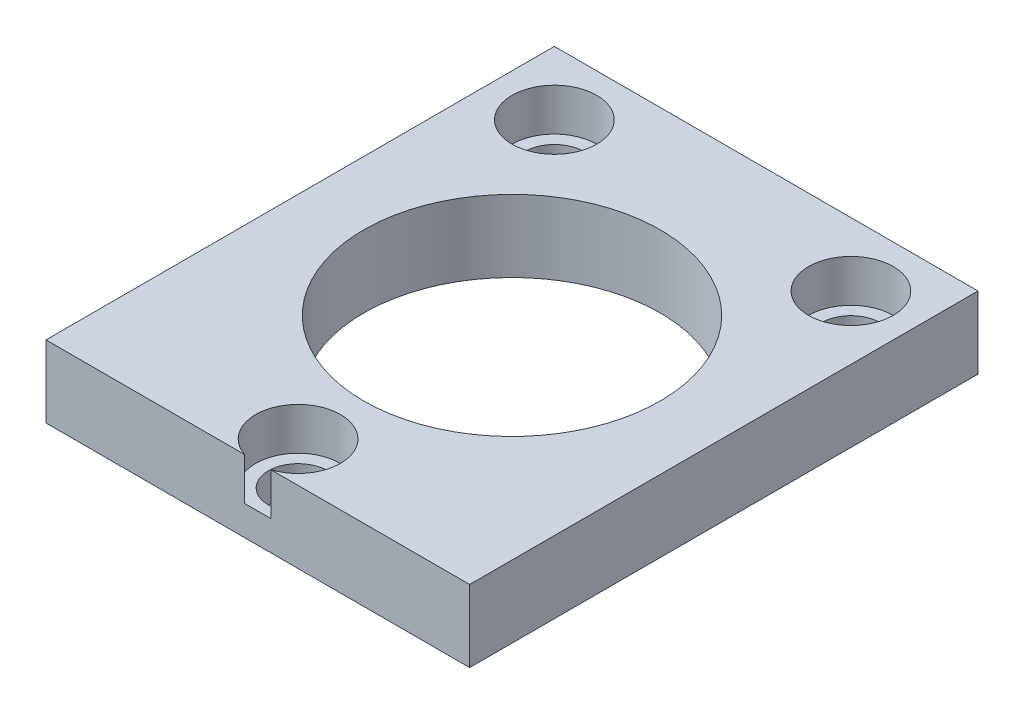
ISO-10303-21;
HEADER;
FILE_DESCRIPTION(('STEP AP214'),'2;1');
FILE_NAME('part.step','',(''),(''),'','','');
FILE_SCHEMA(('AUTOMOTIVE_DESIGN { 1 0 10303 214 1 1 1 1 }'));
ENDSEC;
DATA;
#1=APPLICATION_CONTEXT('core data for automotive mechanical design processes');
#2=APPLICATION_PROTOCOL_DEFINITION('international standard','automotive_design',2000,#1);
#3=PRODUCT_CONTEXT('',#1,'mechanical');
#4=PRODUCT('Part','Part','',(#3));
#5=PRODUCT_RELATED_PRODUCT_CATEGORY('part','',(#4));
#6=PRODUCT_DEFINITION_FORMATION('','',#4);
#7=PRODUCT_DEFINITION_CONTEXT('part definition',#1,'design');
#8=PRODUCT_DEFINITION('design','',#6,#7);
#9=PRODUCT_DEFINITION_SHAPE('','',#8);
#10=(LENGTH_UNIT() NAMED_UNIT(*) SI_UNIT(.MILLI.,.METRE.));
#11=(NAMED_UNIT(*) PLANE_ANGLE_UNIT() SI_UNIT($,.RADIAN.));
#12=(NAMED_UNIT(*) SI_UNIT($,.STERADIAN.) SOLID_ANGLE_UNIT());
#13=UNCERTAINTY_MEASURE_WITH_UNIT(LENGTH_MEASURE(1.E-05),#10,'distance_accuracy_value','');
#14=(GEOMETRIC_REPRESENTATION_CONTEXT(3) GLOBAL_UNCERTAINTY_ASSIGNED_CONTEXT((#13)) GLOBAL_UNIT_ASSIGNED_CONTEXT((#10,
#11,#12)) REPRESENTATION_CONTEXT('',''));
#15=CARTESIAN_POINT('',(0.,0.,0.));
#16=DIRECTION('',(0.,0.,1.));
#17=DIRECTION('',(1.,0.,0.));
#18=AXIS2_PLACEMENT_3D('',#15,#16,#17);
#19=CARTESIAN_POINT('',(-5.,1.7,6.));
#20=DIRECTION('',(0.,0.,-1.));
#21=DIRECTION('',(-1.,0.,0.));
#22=AXIS2_PLACEMENT_3D('',#19,#20,#21);
#23=PLANE('',#22);
#24=DIRECTION('',(0.,1.,0.));
#25=VECTOR('',#24,1.);
#26=CARTESIAN_POINT('',(-0.312249899919912,0.7,6.));
#27=LINE('',#26,#25);
#28=CARTESIAN_POINT('',(-0.312249899919912,1.7,6.));
#29=VERTEX_POINT('',#28);
#30=CARTESIAN_POINT('',(-0.312249899919912,0.7,6.));
#31=VERTEX_POINT('',#30);
#32=EDGE_CURVE('E12',#29,#31,#27,.F.);
#33=ORIENTED_EDGE('',*,*,#32,.F.);
#34=DIRECTION('',(1.,0.,0.));
#35=VECTOR('',#34,1.);
#36=CARTESIAN_POINT('',(-5.,1.7,6.));
#37=LINE('',#36,#35);
#38=CARTESIAN_POINT('',(-5.,1.7,6.));
#39=VERTEX_POINT('',#38);
#40=EDGE_CURVE('E123',#39,#29,#37,.T.);
#41=ORIENTED_EDGE('',*,*,#40,.F.);
#42=DIRECTION('',(0.,-1.,0.));
#43=VECTOR('',#42,1.);
#44=CARTESIAN_POINT('',(-5.,1.7,6.));
#45=LINE('',#44,#43);
#46=CARTESIAN_POINT('',(-5.,0.,6.));
#47=VERTEX_POINT('',#46);
#48=EDGE_CURVE('E73',#39,#47,#45,.T.);
#49=ORIENTED_EDGE('',*,*,#48,.T.);
#50=DIRECTION('',(1.,0.,0.));
#51=VECTOR('',#50,1.);
#52=CARTESIAN_POINT('',(-5.,0.,6.));
#53=LINE('',#52,#51);
#54=CARTESIAN_POINT('',(5.,0.,6.));
#55=VERTEX_POINT('',#54);
#56=EDGE_CURVE('E145',#47,#55,#53,.T.);
#57=ORIENTED_EDGE('',*,*,#56,.T.);
#58=DIRECTION('',(0.,-1.,0.));
#59=VECTOR('',#58,1.);
#60=CARTESIAN_POINT('',(5.,1.7,6.));
#61=LINE('',#60,#59);
#62=CARTESIAN_POINT('',(5.,1.7,6.));
#63=VERTEX_POINT('',#62);
#64=EDGE_CURVE('E127',#63,#55,#61,.T.);
#65=ORIENTED_EDGE('',*,*,#64,.F.);
#66=CARTESIAN_POINT('',(0.312249899919909,1.7,6.));
#67=VERTEX_POINT('',#66);
#68=EDGE_CURVE('E120',#67,#63,#37,.T.);
#69=ORIENTED_EDGE('',*,*,#68,.F.);
#70=DIRECTION('',(0.,1.,0.));
#71=VECTOR('',#70,1.);
#72=CARTESIAN_POINT('',(0.312249899919909,0.7,6.));
#73=LINE('',#72,#71);
#74=CARTESIAN_POINT('',(0.312249899919909,0.7,6.));
#75=VERTEX_POINT('',#74);
#76=EDGE_CURVE('E59',#75,#67,#73,.T.);
#77=ORIENTED_EDGE('',*,*,#76,.F.);
#78=DIRECTION('',(-1.,0.,0.));
#79=VECTOR('',#78,1.);
#80=CARTESIAN_POINT('',(-5.,0.7,6.));
#81=LINE('',#80,#79);
#82=EDGE_CURVE('E161',#75,#31,#81,.T.);
#83=ORIENTED_EDGE('',*,*,#82,.T.);
#84=EDGE_LOOP('',(#33,#41,#49,#57,#65,#69,#77,#83));
#85=FACE_BOUND('',#84,.T.);
#86=ADVANCED_FACE('F51',(#85),#23,.F.);
#87=CARTESIAN_POINT('',(0.,1.7,0.));
#88=DIRECTION('',(0.,-1.,0.));
#89=DIRECTION('',(0.,0.,-1.));
#90=AXIS2_PLACEMENT_3D('',#87,#88,#89);
#91=PLANE('',#90);
#92=CARTESIAN_POINT('',(0.,1.7,5.05));
#93=DIRECTION('',(0.,-1.,0.));
#94=DIRECTION('',(0.,0.,-1.));
#95=AXIS2_PLACEMENT_3D('',#92,#93,#94);
#96=CIRCLE('',#95,1.);
#97=EDGE_CURVE('E112',#29,#67,#96,.T.);
#98=ORIENTED_EDGE('',*,*,#97,.T.);
#99=ORIENTED_EDGE('',*,*,#68,.T.);
#100=DIRECTION('',(0.,0.,-1.));
#101=VECTOR('',#100,1.);
#102=CARTESIAN_POINT('',(5.,1.7,6.));
#103=LINE('',#102,#101);
#104=CARTESIAN_POINT('',(5.,1.7,-6.));
#105=VERTEX_POINT('',#104);
#106=EDGE_CURVE('E129',#63,#105,#103,.T.);
#107=ORIENTED_EDGE('',*,*,#106,.T.);
#108=DIRECTION('',(1.,0.,0.));
#109=VECTOR('',#108,1.);
#110=CARTESIAN_POINT('',(-5.,1.7,-6.));
#111=LINE('',#110,#109);
#112=CARTESIAN_POINT('',(-5.,1.7,-6.));
#113=VERTEX_POINT('',#112);
#114=EDGE_CURVE('E131',#113,#105,#111,.T.);
#115=ORIENTED_EDGE('',*,*,#114,.F.);
#116=DIRECTION('',(0.,0.,-1.));
#117=VECTOR('',#116,1.);
#118=CARTESIAN_POINT('',(-5.,1.7,6.));
#119=LINE('',#118,#117);
#120=EDGE_CURVE('E147',#39,#113,#119,.T.);
#121=ORIENTED_EDGE('',*,*,#120,.F.);
#122=ORIENTED_EDGE('',*,*,#40,.T.);
#123=EDGE_LOOP('',(#98,#99,#107,#115,#121,#122));
#124=FACE_BOUND('',#123,.T.);
#125=CARTESIAN_POINT('',(3.5,1.7,-4.5));
#126=DIRECTION('',(0.,-1.,0.));
#127=DIRECTION('',(0.,0.,-1.));
#128=AXIS2_PLACEMENT_3D('',#125,#126,#127);
#129=CIRCLE('',#128,0.999999999999999);
#130=CARTESIAN_POINT('',(3.5,1.7,-5.5));
#131=VERTEX_POINT('',#130);
#132=EDGE_CURVE('E124',#131,#131,#129,.T.);
#133=ORIENTED_EDGE('',*,*,#132,.T.);
#134=EDGE_LOOP('',(#133));
#135=FACE_BOUND('',#134,.T.);
#136=CARTESIAN_POINT('',(-3.5,1.7,-4.5));
#137=DIRECTION('',(0.,-1.,0.));
#138=DIRECTION('',(0.,0.,-1.));
#139=AXIS2_PLACEMENT_3D('',#136,#137,#138);
#140=CIRCLE('',#139,1.);
#141=CARTESIAN_POINT('',(-3.5,1.7,-5.5));
#142=VERTEX_POINT('',#141);
#143=EDGE_CURVE('E342',#142,#142,#140,.T.);
#144=ORIENTED_EDGE('',*,*,#143,.T.);
#145=EDGE_LOOP('',(#144));
#146=FACE_BOUND('',#145,.T.);
#147=CARTESIAN_POINT('',(0.,1.7,0.));
#148=DIRECTION('',(0.,1.,0.));
#149=DIRECTION('',(0.,0.,1.));
#150=AXIS2_PLACEMENT_3D('',#147,#148,#149);
#151=CIRCLE('',#150,3.5);
#152=CARTESIAN_POINT('',(0.,1.7,3.5));
#153=VERTEX_POINT('',#152);
#154=EDGE_CURVE('E139',#153,#153,#151,.T.);
#155=ORIENTED_EDGE('',*,*,#154,.F.);
#156=EDGE_LOOP('',(#155));
#157=FACE_BOUND('',#156,.T.);
#158=ADVANCED_FACE('F118',(#124,#135,#146,#157),#91,.F.);
#159=CARTESIAN_POINT('',(0.,0.,0.));
#160=DIRECTION('',(0.,-1.,0.));
#161=DIRECTION('',(0.,0.,-1.));
#162=AXIS2_PLACEMENT_3D('',#159,#160,#161);
#163=PLANE('',#162);
#164=CARTESIAN_POINT('',(3.5,0.,-4.5));
#165=DIRECTION('',(0.,-1.,0.));
#166=DIRECTION('',(0.,0.,-1.));
#167=AXIS2_PLACEMENT_3D('',#164,#165,#166);
#168=CIRCLE('',#167,0.7);
#169=CARTESIAN_POINT('',(3.5,0.,-5.2));
#170=VERTEX_POINT('',#169);
#171=EDGE_CURVE('E173',#170,#170,#168,.T.);
#172=ORIENTED_EDGE('',*,*,#171,.F.);
#173=EDGE_LOOP('',(#172));
#174=FACE_BOUND('',#173,.T.);
#175=CARTESIAN_POINT('',(-3.5,0.,-4.5));
#176=DIRECTION('',(0.,-1.,0.));
#177=DIRECTION('',(0.,0.,-1.));
#178=AXIS2_PLACEMENT_3D('',#175,#176,#177);
#179=CIRCLE('',#178,0.7);
#180=CARTESIAN_POINT('',(-3.5,0.,-5.2));
#181=VERTEX_POINT('',#180);
#182=EDGE_CURVE('E167',#181,#181,#179,.T.);
#183=ORIENTED_EDGE('',*,*,#182,.F.);
#184=EDGE_LOOP('',(#183));
#185=FACE_BOUND('',#184,.T.);
#186=CARTESIAN_POINT('',(0.,0.,5.05));
#187=DIRECTION('',(0.,-1.,0.));
#188=DIRECTION('',(0.,0.,-1.));
#189=AXIS2_PLACEMENT_3D('',#186,#187,#188);
#190=CIRCLE('',#189,0.7);
#191=CARTESIAN_POINT('',(0.,0.,4.35));
#192=VERTEX_POINT('',#191);
#193=EDGE_CURVE('E164',#192,#192,#190,.T.);
#194=ORIENTED_EDGE('',*,*,#193,.F.);
#195=EDGE_LOOP('',(#194));
#196=FACE_BOUND('',#195,.T.);
#197=DIRECTION('',(0.,0.,-1.));
#198=VECTOR('',#197,1.);
#199=CARTESIAN_POINT('',(-5.,0.,6.));
#200=LINE('',#199,#198);
#201=CARTESIAN_POINT('',(-5.,0.,-6.));
#202=VERTEX_POINT('',#201);
#203=EDGE_CURVE('E135',#47,#202,#200,.T.);
#204=ORIENTED_EDGE('',*,*,#203,.T.);
#205=DIRECTION('',(1.,0.,0.));
#206=VECTOR('',#205,1.);
#207=CARTESIAN_POINT('',(-5.,0.,-6.));
#208=LINE('',#207,#206);
#209=CARTESIAN_POINT('',(5.,0.,-6.));
#210=VERTEX_POINT('',#209);
#211=EDGE_CURVE('E138',#202,#210,#208,.T.);
#212=ORIENTED_EDGE('',*,*,#211,.T.);
#213=DIRECTION('',(0.,0.,-1.));
#214=VECTOR('',#213,1.);
#215=CARTESIAN_POINT('',(5.,0.,6.));
#216=LINE('',#215,#214);
#217=EDGE_CURVE('E142',#55,#210,#216,.T.);
#218=ORIENTED_EDGE('',*,*,#217,.F.);
#219=ORIENTED_EDGE('',*,*,#56,.F.);
#220=EDGE_LOOP('',(#204,#212,#218,#219));
#221=FACE_BOUND('',#220,.T.);
#222=CARTESIAN_POINT('',(0.,0.,0.));
#223=DIRECTION('',(0.,1.,0.));
#224=DIRECTION('',(0.,0.,1.));
#225=AXIS2_PLACEMENT_3D('',#222,#223,#224);
#226=CIRCLE('',#225,3.5);
#227=CARTESIAN_POINT('',(0.,0.,3.5));
#228=VERTEX_POINT('',#227);
#229=EDGE_CURVE('E176',#228,#228,#226,.T.);
#230=ORIENTED_EDGE('',*,*,#229,.T.);
#231=EDGE_LOOP('',(#230));
#232=FACE_BOUND('',#231,.T.);
#233=ADVANCED_FACE('F187',(#174,#185,#196,#221,#232),#163,.T.);
#234=CARTESIAN_POINT('',(-5.,1.7,6.));
#235=DIRECTION('',(-1.,0.,0.));
#236=DIRECTION('',(0.,0.,1.));
#237=AXIS2_PLACEMENT_3D('',#234,#235,#236);
#238=PLANE('',#237);
#239=ORIENTED_EDGE('',*,*,#203,.F.);
#240=ORIENTED_EDGE('',*,*,#48,.F.);
#241=ORIENTED_EDGE('',*,*,#120,.T.);
#242=DIRECTION('',(0.,-1.,0.));
#243=VECTOR('',#242,1.);
#244=CARTESIAN_POINT('',(-5.,1.7,-6.));
#245=LINE('',#244,#243);
#246=EDGE_CURVE('E98',#113,#202,#245,.T.);
#247=ORIENTED_EDGE('',*,*,#246,.T.);
#248=EDGE_LOOP('',(#239,#240,#241,#247));
#249=FACE_BOUND('',#248,.T.);
#250=ADVANCED_FACE('F53',(#249),#238,.T.);
#251=CARTESIAN_POINT('',(5.,1.7,6.));
#252=DIRECTION('',(-1.,0.,0.));
#253=DIRECTION('',(0.,0.,1.));
#254=AXIS2_PLACEMENT_3D('',#251,#252,#253);
#255=PLANE('',#254);
#256=ORIENTED_EDGE('',*,*,#217,.T.);
#257=DIRECTION('',(0.,-1.,0.));
#258=VECTOR('',#257,1.);
#259=CARTESIAN_POINT('',(5.,1.7,-6.));
#260=LINE('',#259,#258);
#261=EDGE_CURVE('E150',#105,#210,#260,.T.);
#262=ORIENTED_EDGE('',*,*,#261,.F.);
#263=ORIENTED_EDGE('',*,*,#106,.F.);
#264=ORIENTED_EDGE('',*,*,#64,.T.);
#265=EDGE_LOOP('',(#256,#262,#263,#264));
#266=FACE_BOUND('',#265,.T.);
#267=ADVANCED_FACE('F190',(#266),#255,.F.);
#268=CARTESIAN_POINT('',(-5.,1.7,-6.));
#269=DIRECTION('',(0.,0.,-1.));
#270=DIRECTION('',(-1.,0.,0.));
#271=AXIS2_PLACEMENT_3D('',#268,#269,#270);
#272=PLANE('',#271);
#273=ORIENTED_EDGE('',*,*,#211,.F.);
#274=ORIENTED_EDGE('',*,*,#246,.F.);
#275=ORIENTED_EDGE('',*,*,#114,.T.);
#276=ORIENTED_EDGE('',*,*,#261,.T.);
#277=EDGE_LOOP('',(#273,#274,#275,#276));
#278=FACE_BOUND('',#277,.T.);
#279=ADVANCED_FACE('F183',(#278),#272,.T.);
#280=CARTESIAN_POINT('',(0.,1.7,0.));
#281=DIRECTION('',(0.,-1.,0.));
#282=DIRECTION('',(0.,0.,-1.));
#283=AXIS2_PLACEMENT_3D('',#280,#281,#282);
#284=CYLINDRICAL_SURFACE('',#283,3.5);
#285=ORIENTED_EDGE('',*,*,#154,.T.);
#286=EDGE_LOOP('',(#285));
#287=FACE_BOUND('',#286,.T.);
#288=ORIENTED_EDGE('',*,*,#229,.F.);
#289=EDGE_LOOP('',(#288));
#290=FACE_BOUND('',#289,.T.);
#291=ADVANCED_FACE('F197',(#287,#290),#284,.F.);
#292=CARTESIAN_POINT('',(0.,1.7,5.05));
#293=DIRECTION('',(0.,-1.,0.));
#294=DIRECTION('',(0.,0.,-1.));
#295=AXIS2_PLACEMENT_3D('',#292,#293,#294);
#296=CYLINDRICAL_SURFACE('',#295,0.7);
#297=CARTESIAN_POINT('',(0.,0.7,5.05));
#298=DIRECTION('',(0.,-1.,0.));
#299=DIRECTION('',(0.,0.,-1.));
#300=AXIS2_PLACEMENT_3D('',#297,#298,#299);
#301=CIRCLE('',#300,0.7);
#302=CARTESIAN_POINT('',(0.,0.7,4.35));
#303=VERTEX_POINT('',#302);
#304=EDGE_CURVE('E159',#303,#303,#301,.F.);
#305=ORIENTED_EDGE('',*,*,#304,.T.);
#306=EDGE_LOOP('',(#305));
#307=FACE_BOUND('',#306,.T.);
#308=ORIENTED_EDGE('',*,*,#193,.T.);
#309=EDGE_LOOP('',(#308));
#310=FACE_BOUND('',#309,.T.);
#311=ADVANCED_FACE('F210',(#307,#310),#296,.F.);
#312=CARTESIAN_POINT('',(-3.5,1.7,-4.5));
#313=DIRECTION('',(0.,-1.,0.));
#314=DIRECTION('',(0.,0.,-1.));
#315=AXIS2_PLACEMENT_3D('',#312,#313,#314);
#316=CYLINDRICAL_SURFACE('',#315,0.7);
#317=CARTESIAN_POINT('',(-3.5,0.7,-4.5));
#318=DIRECTION('',(0.,-1.,0.));
#319=DIRECTION('',(0.,0.,-1.));
#320=AXIS2_PLACEMENT_3D('',#317,#318,#319);
#321=CIRCLE('',#320,0.7);
#322=CARTESIAN_POINT('',(-3.5,0.7,-5.2));
#323=VERTEX_POINT('',#322);
#324=EDGE_CURVE('E156',#323,#323,#321,.F.);
#325=ORIENTED_EDGE('',*,*,#324,.T.);
#326=EDGE_LOOP('',(#325));
#327=FACE_BOUND('',#326,.T.);
#328=ORIENTED_EDGE('',*,*,#182,.T.);
#329=EDGE_LOOP('',(#328));
#330=FACE_BOUND('',#329,.T.);
#331=ADVANCED_FACE('F214',(#327,#330),#316,.F.);
#332=CARTESIAN_POINT('',(3.5,1.7,-4.5));
#333=DIRECTION('',(0.,-1.,0.));
#334=DIRECTION('',(0.,0.,-1.));
#335=AXIS2_PLACEMENT_3D('',#332,#333,#334);
#336=CYLINDRICAL_SURFACE('',#335,0.7);
#337=CARTESIAN_POINT('',(3.5,0.7,-4.5));
#338=DIRECTION('',(0.,-1.,0.));
#339=DIRECTION('',(0.,0.,-1.));
#340=AXIS2_PLACEMENT_3D('',#337,#338,#339);
#341=CIRCLE('',#340,0.7);
#342=CARTESIAN_POINT('',(3.5,0.7,-5.2));
#343=VERTEX_POINT('',#342);
#344=EDGE_CURVE('E153',#343,#343,#341,.F.);
#345=ORIENTED_EDGE('',*,*,#344,.T.);
#346=EDGE_LOOP('',(#345));
#347=FACE_BOUND('',#346,.T.);
#348=ORIENTED_EDGE('',*,*,#171,.T.);
#349=EDGE_LOOP('',(#348));
#350=FACE_BOUND('',#349,.T.);
#351=ADVANCED_FACE('F217',(#347,#350),#336,.F.);
#352=CARTESIAN_POINT('',(3.5,0.7,-4.5));
#353=DIRECTION('',(0.,-1.,0.));
#354=DIRECTION('',(0.,0.,-1.));
#355=AXIS2_PLACEMENT_3D('',#352,#353,#354);
#356=PLANE('',#355);
#357=CARTESIAN_POINT('',(3.5,0.7,-4.5));
#358=DIRECTION('',(0.,-1.,0.));
#359=DIRECTION('',(0.,0.,-1.));
#360=AXIS2_PLACEMENT_3D('',#357,#358,#359);
#361=CIRCLE('',#360,0.999999999999999);
#362=CARTESIAN_POINT('',(3.5,0.7,-5.5));
#363=VERTEX_POINT('',#362);
#364=EDGE_CURVE('E338',#363,#363,#361,.T.);
#365=ORIENTED_EDGE('',*,*,#364,.F.);
#366=EDGE_LOOP('',(#365));
#367=FACE_BOUND('',#366,.T.);
#368=ORIENTED_EDGE('',*,*,#344,.F.);
#369=EDGE_LOOP('',(#368));
#370=FACE_BOUND('',#369,.T.);
#371=ADVANCED_FACE('F221',(#367,#370),#356,.F.);
#372=CARTESIAN_POINT('',(3.5,0.7,-4.5));
#373=DIRECTION('',(0.,1.,0.));
#374=DIRECTION('',(0.,0.,1.));
#375=AXIS2_PLACEMENT_3D('',#372,#373,#374);
#376=CYLINDRICAL_SURFACE('',#375,0.999999999999999);
#377=ORIENTED_EDGE('',*,*,#364,.T.);
#378=EDGE_LOOP('',(#377));
#379=FACE_BOUND('',#378,.T.);
#380=ORIENTED_EDGE('',*,*,#132,.F.);
#381=EDGE_LOOP('',(#380));
#382=FACE_BOUND('',#381,.T.);
#383=ADVANCED_FACE('F227',(#379,#382),#376,.F.);
#384=CARTESIAN_POINT('',(-3.5,0.7,-4.5));
#385=DIRECTION('',(0.,-1.,0.));
#386=DIRECTION('',(0.,0.,-1.));
#387=AXIS2_PLACEMENT_3D('',#384,#385,#386);
#388=PLANE('',#387);
#389=CARTESIAN_POINT('',(-3.5,0.7,-4.5));
#390=DIRECTION('',(0.,-1.,0.));
#391=DIRECTION('',(0.,0.,-1.));
#392=AXIS2_PLACEMENT_3D('',#389,#390,#391);
#393=CIRCLE('',#392,1.);
#394=CARTESIAN_POINT('',(-3.5,0.7,-5.5));
#395=VERTEX_POINT('',#394);
#396=EDGE_CURVE('E171',#395,#395,#393,.T.);
#397=ORIENTED_EDGE('',*,*,#396,.F.);
#398=EDGE_LOOP('',(#397));
#399=FACE_BOUND('',#398,.T.);
#400=ORIENTED_EDGE('',*,*,#324,.F.);
#401=EDGE_LOOP('',(#400));
#402=FACE_BOUND('',#401,.T.);
#403=ADVANCED_FACE('F223',(#399,#402),#388,.F.);
#404=CARTESIAN_POINT('',(-3.5,0.7,-4.5));
#405=DIRECTION('',(0.,1.,0.));
#406=DIRECTION('',(0.,0.,1.));
#407=AXIS2_PLACEMENT_3D('',#404,#405,#406);
#408=CYLINDRICAL_SURFACE('',#407,1.);
#409=ORIENTED_EDGE('',*,*,#396,.T.);
#410=EDGE_LOOP('',(#409));
#411=FACE_BOUND('',#410,.T.);
#412=ORIENTED_EDGE('',*,*,#143,.F.);
#413=EDGE_LOOP('',(#412));
#414=FACE_BOUND('',#413,.T.);
#415=ADVANCED_FACE('F226',(#411,#414),#408,.F.);
#416=CARTESIAN_POINT('',(0.,0.7,5.05));
#417=DIRECTION('',(0.,1.,0.));
#418=DIRECTION('',(0.,0.,1.));
#419=AXIS2_PLACEMENT_3D('',#416,#417,#418);
#420=CYLINDRICAL_SURFACE('',#419,1.);
#421=ORIENTED_EDGE('',*,*,#32,.T.);
#422=CARTESIAN_POINT('',(0.,0.7,5.05));
#423=DIRECTION('',(0.,-1.,0.));
#424=DIRECTION('',(0.,0.,-1.));
#425=AXIS2_PLACEMENT_3D('',#422,#423,#424);
#426=CIRCLE('',#425,1.);
#427=EDGE_CURVE('E65',#31,#75,#426,.T.);
#428=ORIENTED_EDGE('',*,*,#427,.T.);
#429=ORIENTED_EDGE('',*,*,#76,.T.);
#430=ORIENTED_EDGE('',*,*,#97,.F.);
#431=EDGE_LOOP('',(#421,#428,#429,#430));
#432=FACE_BOUND('',#431,.T.);
#433=ADVANCED_FACE('F111',(#432),#420,.F.);
#434=CARTESIAN_POINT('',(0.,0.7,5.05));
#435=DIRECTION('',(0.,-1.,0.));
#436=DIRECTION('',(0.,0.,-1.));
#437=AXIS2_PLACEMENT_3D('',#434,#435,#436);
#438=PLANE('',#437);
#439=ORIENTED_EDGE('',*,*,#304,.F.);
#440=EDGE_LOOP('',(#439));
#441=FACE_BOUND('',#440,.T.);
#442=ORIENTED_EDGE('',*,*,#427,.F.);
#443=ORIENTED_EDGE('',*,*,#82,.F.);
#444=EDGE_LOOP('',(#442,#443));
#445=FACE_BOUND('',#444,.T.);
#446=ADVANCED_FACE('F240',(#441,#445),#438,.F.);
#447=CLOSED_SHELL('',(#86,#158,#233,#250,#267,#279,#291,#311,#331,#351,#371,#383,#403,#415,#433,#446));
#448=MANIFOLD_SOLID_BREP('B2',#447);
#449=ADVANCED_BREP_SHAPE_REPRESENTATION('',(#18,#448),#14);
#450=SHAPE_DEFINITION_REPRESENTATION(#9,#449);
ENDSEC;
END-ISO-10303-21;
